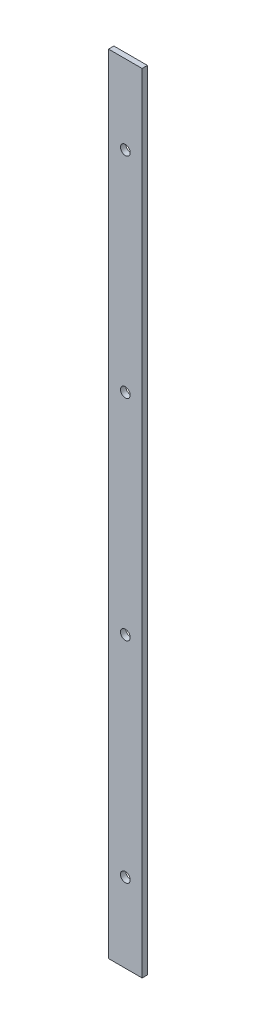
ISO-10303-21;
HEADER;
FILE_DESCRIPTION(('STEP AP214'),'2;1');
FILE_NAME('part.step','',(''),(''),'','','');
FILE_SCHEMA(('AUTOMOTIVE_DESIGN { 1 0 10303 214 1 1 1 1 }'));
ENDSEC;
DATA;
#1=APPLICATION_CONTEXT('core data for automotive mechanical design processes');
#2=APPLICATION_PROTOCOL_DEFINITION('international standard','automotive_design',2000,#1);
#3=PRODUCT_CONTEXT('',#1,'mechanical');
#4=PRODUCT('Part','Part','',(#3));
#5=PRODUCT_RELATED_PRODUCT_CATEGORY('part','',(#4));
#6=PRODUCT_DEFINITION_FORMATION('','',#4);
#7=PRODUCT_DEFINITION_CONTEXT('part definition',#1,'design');
#8=PRODUCT_DEFINITION('design','',#6,#7);
#9=PRODUCT_DEFINITION_SHAPE('','',#8);
#10=(LENGTH_UNIT() NAMED_UNIT(*) SI_UNIT(.MILLI.,.METRE.));
#11=(NAMED_UNIT(*) PLANE_ANGLE_UNIT() SI_UNIT($,.RADIAN.));
#12=(NAMED_UNIT(*) SI_UNIT($,.STERADIAN.) SOLID_ANGLE_UNIT());
#13=UNCERTAINTY_MEASURE_WITH_UNIT(LENGTH_MEASURE(1.E-05),#10,'distance_accuracy_value','');
#14=(GEOMETRIC_REPRESENTATION_CONTEXT(3) GLOBAL_UNCERTAINTY_ASSIGNED_CONTEXT((#13)) GLOBAL_UNIT_ASSIGNED_CONTEXT((#10,
#11,#12)) REPRESENTATION_CONTEXT('',''));
#15=CARTESIAN_POINT('',(0.,0.,0.));
#16=DIRECTION('',(0.,0.,1.));
#17=DIRECTION('',(1.,0.,0.));
#18=AXIS2_PLACEMENT_3D('',#15,#16,#17);
#19=CARTESIAN_POINT('',(0.,0.,3.175));
#20=DIRECTION('',(1.,0.,0.));
#21=DIRECTION('',(0.,0.,-1.));
#22=AXIS2_PLACEMENT_3D('',#19,#20,#21);
#23=PLANE('',#22);
#24=DIRECTION('',(0.,-1.,0.));
#25=VECTOR('',#24,1.);
#26=CARTESIAN_POINT('',(0.,0.,0.));
#27=LINE('',#26,#25);
#28=CARTESIAN_POINT('',(0.,469.,0.));
#29=VERTEX_POINT('',#28);
#30=CARTESIAN_POINT('',(0.,0.,0.));
#31=VERTEX_POINT('',#30);
#32=EDGE_CURVE('E97',#29,#31,#27,.T.);
#33=ORIENTED_EDGE('',*,*,#32,.T.);
#34=DIRECTION('',(0.,0.,-1.));
#35=VECTOR('',#34,1.);
#36=CARTESIAN_POINT('',(0.,0.,3.175));
#37=LINE('',#36,#35);
#38=CARTESIAN_POINT('',(0.,0.,3.175));
#39=VERTEX_POINT('',#38);
#40=EDGE_CURVE('E11',#39,#31,#37,.T.);
#41=ORIENTED_EDGE('',*,*,#40,.F.);
#42=DIRECTION('',(0.,-1.,0.));
#43=VECTOR('',#42,1.);
#44=CARTESIAN_POINT('',(0.,0.,3.175));
#45=LINE('',#44,#43);
#46=CARTESIAN_POINT('',(0.,469.,3.175));
#47=VERTEX_POINT('',#46);
#48=EDGE_CURVE('E85',#47,#39,#45,.T.);
#49=ORIENTED_EDGE('',*,*,#48,.F.);
#50=DIRECTION('',(0.,0.,-1.));
#51=VECTOR('',#50,1.);
#52=CARTESIAN_POINT('',(0.,469.,3.175));
#53=LINE('',#52,#51);
#54=EDGE_CURVE('E93',#47,#29,#53,.T.);
#55=ORIENTED_EDGE('',*,*,#54,.T.);
#56=EDGE_LOOP('',(#33,#41,#49,#55));
#57=FACE_BOUND('',#56,.T.);
#58=ADVANCED_FACE('F34',(#57),#23,.F.);
#59=CARTESIAN_POINT('',(0.,0.,3.175));
#60=DIRECTION('',(0.,1.,0.));
#61=DIRECTION('',(0.,0.,1.));
#62=AXIS2_PLACEMENT_3D('',#59,#60,#61);
#63=PLANE('',#62);
#64=DIRECTION('',(1.,0.,0.));
#65=VECTOR('',#64,1.);
#66=CARTESIAN_POINT('',(0.,0.,0.));
#67=LINE('',#66,#65);
#68=CARTESIAN_POINT('',(20.,0.,0.));
#69=VERTEX_POINT('',#68);
#70=EDGE_CURVE('E89',#31,#69,#67,.T.);
#71=ORIENTED_EDGE('',*,*,#70,.T.);
#72=DIRECTION('',(0.,0.,-1.));
#73=VECTOR('',#72,1.);
#74=CARTESIAN_POINT('',(20.,0.,3.175));
#75=LINE('',#74,#73);
#76=CARTESIAN_POINT('',(20.,0.,3.175));
#77=VERTEX_POINT('',#76);
#78=EDGE_CURVE('E42',#77,#69,#75,.T.);
#79=ORIENTED_EDGE('',*,*,#78,.F.);
#80=DIRECTION('',(1.,0.,0.));
#81=VECTOR('',#80,1.);
#82=CARTESIAN_POINT('',(0.,0.,3.175));
#83=LINE('',#82,#81);
#84=EDGE_CURVE('E80',#39,#77,#83,.T.);
#85=ORIENTED_EDGE('',*,*,#84,.F.);
#86=ORIENTED_EDGE('',*,*,#40,.T.);
#87=EDGE_LOOP('',(#71,#79,#85,#86));
#88=FACE_BOUND('',#87,.T.);
#89=ADVANCED_FACE('F88',(#88),#63,.F.);
#90=CARTESIAN_POINT('',(20.,0.,3.175));
#91=DIRECTION('',(-1.,0.,0.));
#92=DIRECTION('',(0.,0.,1.));
#93=AXIS2_PLACEMENT_3D('',#90,#91,#92);
#94=PLANE('',#93);
#95=DIRECTION('',(0.,1.,0.));
#96=VECTOR('',#95,1.);
#97=CARTESIAN_POINT('',(20.,0.,0.));
#98=LINE('',#97,#96);
#99=CARTESIAN_POINT('',(20.,469.,0.));
#100=VERTEX_POINT('',#99);
#101=EDGE_CURVE('E67',#69,#100,#98,.T.);
#102=ORIENTED_EDGE('',*,*,#101,.T.);
#103=DIRECTION('',(0.,0.,-1.));
#104=VECTOR('',#103,1.);
#105=CARTESIAN_POINT('',(20.,469.,3.175));
#106=LINE('',#105,#104);
#107=CARTESIAN_POINT('',(20.,469.,3.175));
#108=VERTEX_POINT('',#107);
#109=EDGE_CURVE('E90',#108,#100,#106,.T.);
#110=ORIENTED_EDGE('',*,*,#109,.F.);
#111=DIRECTION('',(0.,1.,0.));
#112=VECTOR('',#111,1.);
#113=CARTESIAN_POINT('',(20.,0.,3.175));
#114=LINE('',#113,#112);
#115=EDGE_CURVE('E83',#77,#108,#114,.T.);
#116=ORIENTED_EDGE('',*,*,#115,.F.);
#117=ORIENTED_EDGE('',*,*,#78,.T.);
#118=EDGE_LOOP('',(#102,#110,#116,#117));
#119=FACE_BOUND('',#118,.T.);
#120=ADVANCED_FACE('F91',(#119),#94,.F.);
#121=CARTESIAN_POINT('',(0.,469.,3.175));
#122=DIRECTION('',(0.,-1.,0.));
#123=DIRECTION('',(0.,0.,-1.));
#124=AXIS2_PLACEMENT_3D('',#121,#122,#123);
#125=PLANE('',#124);
#126=DIRECTION('',(-1.,0.,0.));
#127=VECTOR('',#126,1.);
#128=CARTESIAN_POINT('',(0.,469.,0.));
#129=LINE('',#128,#127);
#130=EDGE_CURVE('E73',#100,#29,#129,.T.);
#131=ORIENTED_EDGE('',*,*,#130,.T.);
#132=ORIENTED_EDGE('',*,*,#54,.F.);
#133=DIRECTION('',(-1.,0.,0.));
#134=VECTOR('',#133,1.);
#135=CARTESIAN_POINT('',(0.,469.,3.175));
#136=LINE('',#135,#134);
#137=EDGE_CURVE('E50',#108,#47,#136,.T.);
#138=ORIENTED_EDGE('',*,*,#137,.F.);
#139=ORIENTED_EDGE('',*,*,#109,.T.);
#140=EDGE_LOOP('',(#131,#132,#138,#139));
#141=FACE_BOUND('',#140,.T.);
#142=ADVANCED_FACE('F105',(#141),#125,.F.);
#143=CARTESIAN_POINT('',(0.,0.,3.175));
#144=DIRECTION('',(0.,0.,-1.));
#145=DIRECTION('',(-1.,0.,0.));
#146=AXIS2_PLACEMENT_3D('',#143,#144,#145);
#147=PLANE('',#146);
#148=CARTESIAN_POINT('',(10.,422.,3.175));
#149=DIRECTION('',(0.,0.,1.));
#150=DIRECTION('',(1.,0.,0.));
#151=AXIS2_PLACEMENT_3D('',#148,#149,#150);
#152=CIRCLE('',#151,2.89999999999999);
#153=CARTESIAN_POINT('',(12.9,422.,3.175));
#154=VERTEX_POINT('',#153);
#155=EDGE_CURVE('E131',#154,#154,#152,.T.);
#156=ORIENTED_EDGE('',*,*,#155,.F.);
#157=EDGE_LOOP('',(#156));
#158=FACE_BOUND('',#157,.T.);
#159=CARTESIAN_POINT('',(10.,297.,3.175));
#160=DIRECTION('',(0.,0.,1.));
#161=DIRECTION('',(1.,0.,0.));
#162=AXIS2_PLACEMENT_3D('',#159,#160,#161);
#163=CIRCLE('',#162,2.89999999999999);
#164=CARTESIAN_POINT('',(12.9,297.,3.175));
#165=VERTEX_POINT('',#164);
#166=EDGE_CURVE('E125',#165,#165,#163,.T.);
#167=ORIENTED_EDGE('',*,*,#166,.F.);
#168=EDGE_LOOP('',(#167));
#169=FACE_BOUND('',#168,.T.);
#170=CARTESIAN_POINT('',(10.,172.,3.175));
#171=DIRECTION('',(0.,0.,1.));
#172=DIRECTION('',(1.,0.,0.));
#173=AXIS2_PLACEMENT_3D('',#170,#171,#172);
#174=CIRCLE('',#173,2.89999999999999);
#175=CARTESIAN_POINT('',(12.9,172.,3.175));
#176=VERTEX_POINT('',#175);
#177=EDGE_CURVE('E119',#176,#176,#174,.T.);
#178=ORIENTED_EDGE('',*,*,#177,.F.);
#179=EDGE_LOOP('',(#178));
#180=FACE_BOUND('',#179,.T.);
#181=CARTESIAN_POINT('',(10.,47.,3.175));
#182=DIRECTION('',(0.,0.,1.));
#183=DIRECTION('',(1.,0.,0.));
#184=AXIS2_PLACEMENT_3D('',#181,#182,#183);
#185=CIRCLE('',#184,2.89999999999999);
#186=CARTESIAN_POINT('',(12.9,47.,3.175));
#187=VERTEX_POINT('',#186);
#188=EDGE_CURVE('E113',#187,#187,#185,.T.);
#189=ORIENTED_EDGE('',*,*,#188,.F.);
#190=EDGE_LOOP('',(#189));
#191=FACE_BOUND('',#190,.T.);
#192=ORIENTED_EDGE('',*,*,#48,.T.);
#193=ORIENTED_EDGE('',*,*,#84,.T.);
#194=ORIENTED_EDGE('',*,*,#115,.T.);
#195=ORIENTED_EDGE('',*,*,#137,.T.);
#196=EDGE_LOOP('',(#192,#193,#194,#195));
#197=FACE_BOUND('',#196,.T.);
#198=ADVANCED_FACE('F81',(#158,#169,#180,#191,#197),#147,.F.);
#199=CARTESIAN_POINT('',(0.,0.,0.));
#200=DIRECTION('',(0.,0.,-1.));
#201=DIRECTION('',(-1.,0.,0.));
#202=AXIS2_PLACEMENT_3D('',#199,#200,#201);
#203=PLANE('',#202);
#204=CARTESIAN_POINT('',(10.,422.,0.));
#205=DIRECTION('',(0.,0.,1.));
#206=DIRECTION('',(1.,0.,0.));
#207=AXIS2_PLACEMENT_3D('',#204,#205,#206);
#208=CIRCLE('',#207,2.9);
#209=CARTESIAN_POINT('',(12.9,422.,0.));
#210=VERTEX_POINT('',#209);
#211=EDGE_CURVE('E128',#210,#210,#208,.T.);
#212=ORIENTED_EDGE('',*,*,#211,.T.);
#213=EDGE_LOOP('',(#212));
#214=FACE_BOUND('',#213,.T.);
#215=CARTESIAN_POINT('',(10.,297.,0.));
#216=DIRECTION('',(0.,0.,1.));
#217=DIRECTION('',(1.,0.,0.));
#218=AXIS2_PLACEMENT_3D('',#215,#216,#217);
#219=CIRCLE('',#218,2.9);
#220=CARTESIAN_POINT('',(12.9,297.,0.));
#221=VERTEX_POINT('',#220);
#222=EDGE_CURVE('E122',#221,#221,#219,.T.);
#223=ORIENTED_EDGE('',*,*,#222,.T.);
#224=EDGE_LOOP('',(#223));
#225=FACE_BOUND('',#224,.T.);
#226=CARTESIAN_POINT('',(10.,172.,0.));
#227=DIRECTION('',(0.,0.,1.));
#228=DIRECTION('',(1.,0.,0.));
#229=AXIS2_PLACEMENT_3D('',#226,#227,#228);
#230=CIRCLE('',#229,2.9);
#231=CARTESIAN_POINT('',(12.9,172.,0.));
#232=VERTEX_POINT('',#231);
#233=EDGE_CURVE('E116',#232,#232,#230,.T.);
#234=ORIENTED_EDGE('',*,*,#233,.T.);
#235=EDGE_LOOP('',(#234));
#236=FACE_BOUND('',#235,.T.);
#237=CARTESIAN_POINT('',(10.,47.,0.));
#238=DIRECTION('',(0.,0.,1.));
#239=DIRECTION('',(1.,0.,0.));
#240=AXIS2_PLACEMENT_3D('',#237,#238,#239);
#241=CIRCLE('',#240,2.9);
#242=CARTESIAN_POINT('',(12.9,47.,0.));
#243=VERTEX_POINT('',#242);
#244=EDGE_CURVE('E100',#243,#243,#241,.T.);
#245=ORIENTED_EDGE('',*,*,#244,.T.);
#246=EDGE_LOOP('',(#245));
#247=FACE_BOUND('',#246,.T.);
#248=ORIENTED_EDGE('',*,*,#32,.F.);
#249=ORIENTED_EDGE('',*,*,#130,.F.);
#250=ORIENTED_EDGE('',*,*,#101,.F.);
#251=ORIENTED_EDGE('',*,*,#70,.F.);
#252=EDGE_LOOP('',(#248,#249,#250,#251));
#253=FACE_BOUND('',#252,.T.);
#254=ADVANCED_FACE('F108',(#214,#225,#236,#247,#253),#203,.T.);
#255=CARTESIAN_POINT('',(10.,47.,3.175));
#256=DIRECTION('',(0.,0.,1.));
#257=DIRECTION('',(1.,0.,0.));
#258=AXIS2_PLACEMENT_3D('',#255,#256,#257);
#259=CYLINDRICAL_SURFACE('',#258,2.89999999999999);
#260=ORIENTED_EDGE('',*,*,#244,.F.);
#261=EDGE_LOOP('',(#260));
#262=FACE_BOUND('',#261,.T.);
#263=ORIENTED_EDGE('',*,*,#188,.T.);
#264=EDGE_LOOP('',(#263));
#265=FACE_BOUND('',#264,.T.);
#266=ADVANCED_FACE('F146',(#262,#265),#259,.F.);
#267=CARTESIAN_POINT('',(10.,172.,3.175));
#268=DIRECTION('',(0.,0.,1.));
#269=DIRECTION('',(1.,0.,0.));
#270=AXIS2_PLACEMENT_3D('',#267,#268,#269);
#271=CYLINDRICAL_SURFACE('',#270,2.89999999999999);
#272=ORIENTED_EDGE('',*,*,#233,.F.);
#273=EDGE_LOOP('',(#272));
#274=FACE_BOUND('',#273,.T.);
#275=ORIENTED_EDGE('',*,*,#177,.T.);
#276=EDGE_LOOP('',(#275));
#277=FACE_BOUND('',#276,.T.);
#278=ADVANCED_FACE('F148',(#274,#277),#271,.F.);
#279=CARTESIAN_POINT('',(10.,297.,3.175));
#280=DIRECTION('',(0.,0.,1.));
#281=DIRECTION('',(1.,0.,0.));
#282=AXIS2_PLACEMENT_3D('',#279,#280,#281);
#283=CYLINDRICAL_SURFACE('',#282,2.89999999999999);
#284=ORIENTED_EDGE('',*,*,#222,.F.);
#285=EDGE_LOOP('',(#284));
#286=FACE_BOUND('',#285,.T.);
#287=ORIENTED_EDGE('',*,*,#166,.T.);
#288=EDGE_LOOP('',(#287));
#289=FACE_BOUND('',#288,.T.);
#290=ADVANCED_FACE('F155',(#286,#289),#283,.F.);
#291=CARTESIAN_POINT('',(10.,422.,3.175));
#292=DIRECTION('',(0.,0.,1.));
#293=DIRECTION('',(1.,0.,0.));
#294=AXIS2_PLACEMENT_3D('',#291,#292,#293);
#295=CYLINDRICAL_SURFACE('',#294,2.89999999999999);
#296=ORIENTED_EDGE('',*,*,#211,.F.);
#297=EDGE_LOOP('',(#296));
#298=FACE_BOUND('',#297,.T.);
#299=ORIENTED_EDGE('',*,*,#155,.T.);
#300=EDGE_LOOP('',(#299));
#301=FACE_BOUND('',#300,.T.);
#302=ADVANCED_FACE('F135',(#298,#301),#295,.F.);
#303=CLOSED_SHELL('',(#58,#89,#120,#142,#198,#254,#266,#278,#290,#302));
#304=MANIFOLD_SOLID_BREP('B2',#303);
#305=ADVANCED_BREP_SHAPE_REPRESENTATION('',(#18,#304),#14);
#306=SHAPE_DEFINITION_REPRESENTATION(#9,#305);
ENDSEC;
END-ISO-10303-21;
